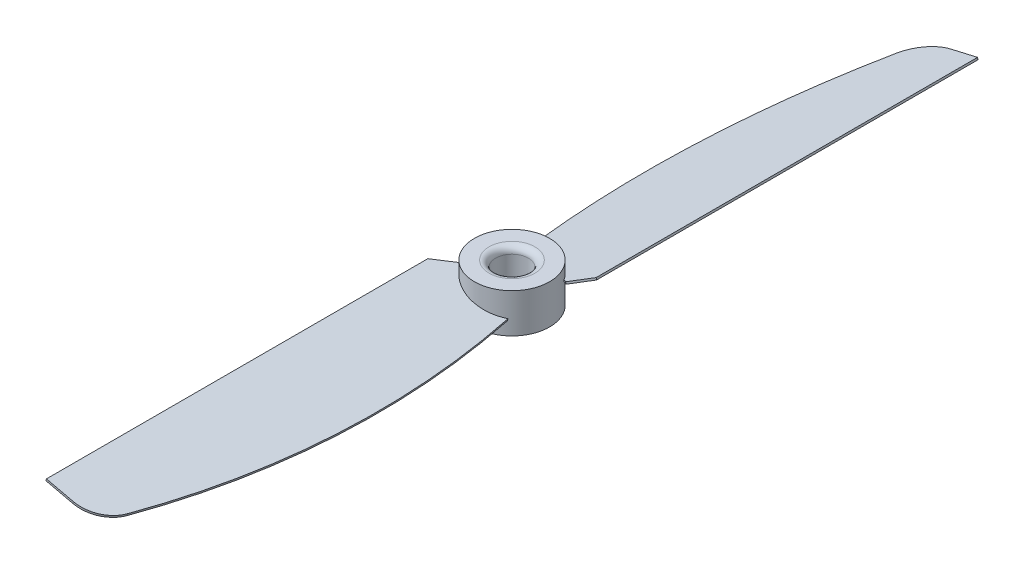
ISO-10303-21;
HEADER;
FILE_DESCRIPTION(('STEP AP214'),'2;1');
FILE_NAME('part.step','',(''),(''),'','','');
FILE_SCHEMA(('AUTOMOTIVE_DESIGN { 1 0 10303 214 1 1 1 1 }'));
ENDSEC;
DATA;
#1=APPLICATION_CONTEXT('core data for automotive mechanical design processes');
#2=APPLICATION_PROTOCOL_DEFINITION('international standard','automotive_design',2000,#1);
#3=PRODUCT_CONTEXT('',#1,'mechanical');
#4=PRODUCT('Part','Part','',(#3));
#5=PRODUCT_RELATED_PRODUCT_CATEGORY('part','',(#4));
#6=PRODUCT_DEFINITION_FORMATION('','',#4);
#7=PRODUCT_DEFINITION_CONTEXT('part definition',#1,'design');
#8=PRODUCT_DEFINITION('design','',#6,#7);
#9=PRODUCT_DEFINITION_SHAPE('','',#8);
#10=(LENGTH_UNIT() NAMED_UNIT(*) SI_UNIT(.MILLI.,.METRE.));
#11=(NAMED_UNIT(*) PLANE_ANGLE_UNIT() SI_UNIT($,.RADIAN.));
#12=(NAMED_UNIT(*) SI_UNIT($,.STERADIAN.) SOLID_ANGLE_UNIT());
#13=UNCERTAINTY_MEASURE_WITH_UNIT(LENGTH_MEASURE(1.E-05),#10,'distance_accuracy_value','');
#14=(GEOMETRIC_REPRESENTATION_CONTEXT(3) GLOBAL_UNCERTAINTY_ASSIGNED_CONTEXT((#13)) GLOBAL_UNIT_ASSIGNED_CONTEXT((#10,
#11,#12)) REPRESENTATION_CONTEXT('',''));
#15=CARTESIAN_POINT('',(0.,0.,0.));
#16=DIRECTION('',(0.,0.,1.));
#17=DIRECTION('',(1.,0.,0.));
#18=AXIS2_PLACEMENT_3D('',#15,#16,#17);
#19=CARTESIAN_POINT('',(0.,3.,0.));
#20=DIRECTION('',(0.,-1.,0.));
#21=DIRECTION('',(0.,0.,-1.));
#22=AXIS2_PLACEMENT_3D('',#19,#20,#21);
#23=CYLINDRICAL_SURFACE('',#22,5.75);
#24=CARTESIAN_POINT('',(0.,-0.153945616169009,0.));
#25=DIRECTION('',(0.224951054343865,0.974370064785235,0.));
#26=DIRECTION('',(0.974370064785235,-0.224951054343865,0.));
#27=AXIS2_PLACEMENT_3D('',#24,#25,#26);
#28=ELLIPSE('',#27,5.901248619812,5.75);
#29=CARTESIAN_POINT('',(-4.81679524919499,0.958099190034846,3.14022029917223));
#30=VERTEX_POINT('',#29);
#31=CARTESIAN_POINT('',(3.69343416007661,-1.00664207974727,4.40693137060024));
#32=VERTEX_POINT('',#31);
#33=EDGE_CURVE('E263',#30,#32,#28,.T.);
#34=ORIENTED_EDGE('',*,*,#33,.F.);
#35=CARTESIAN_POINT('',(-5.01099790460841,3.,2.82000000000181));
#36=CARTESIAN_POINT('',(-4.98435957875348,2.75333521853952,2.86729453573242));
#37=CARTESIAN_POINT('',(-4.95875906454369,2.50593733768936,2.9112585018136));
#38=CARTESIAN_POINT('',(-4.9097770267066,2.00995677254365,2.99314624383128));
#39=CARTESIAN_POINT('',(-4.88639520910258,1.76137424980963,3.03107082043824));
#40=CARTESIAN_POINT('',(-4.84202154089227,1.26363002897529,3.10145782518244));
#41=CARTESIAN_POINT('',(-4.82102600695424,1.01446984629513,3.13392870938984));
#42=CARTESIAN_POINT('',(-4.78141224905732,0.515376888592289,3.19403933249674));
#43=CARTESIAN_POINT('',(-4.76279410313816,0.265444088483488,3.22167891281569));
#44=CARTESIAN_POINT('',(-4.71049426952614,-0.485164034300471,3.29812336062005));
#45=CARTESIAN_POINT('',(-4.68035753807278,-0.986757471257977,3.34046877892435));
#46=CARTESIAN_POINT('',(-4.64177976149942,-1.74056558646675,3.39364554616675));
#47=CARTESIAN_POINT('',(-4.63001813796453,-1.99227826444247,3.40965644988569));
#48=CARTESIAN_POINT('',(-4.60860566926014,-2.49595987999339,3.43854259476011));
#49=CARTESIAN_POINT('',(-4.59895470600721,-2.74792880243989,3.45141801133877));
#50=CARTESIAN_POINT('',(-4.59030209218026,-3.00000000000025,3.46289282284704));
#51=B_SPLINE_CURVE_WITH_KNOTS('',3,(#35,#36,#37,#38,#39,#40,#41,#42,#43,#44,#45,#46,#47,#48,#49,
#50),.UNSPECIFIED.,.F.,.F.,(4,2,2,2,2,2,2,4),(0.,0.757649587981797,1.51519864699756,
2.27156204339986,3.02795026167649,4.54039745487371,5.29786427141661,6.05528869971719),.UNSPECIFIED.);
#52=CARTESIAN_POINT('',(-4.84315293595474,1.27207557383734,3.09941440258511));
#53=VERTEX_POINT('',#52);
#54=EDGE_CURVE('E255',#53,#30,#51,.T.);
#55=ORIENTED_EDGE('',*,*,#54,.F.);
#56=CARTESIAN_POINT('',(0.,0.153945616169009,0.));
#57=DIRECTION('',(0.224951054343865,0.974370064785235,0.));
#58=DIRECTION('',(0.974370064785235,-0.224951054343865,0.));
#59=AXIS2_PLACEMENT_3D('',#56,#57,#58);
#60=ELLIPSE('',#59,5.901248619812,5.75);
#61=CARTESIAN_POINT('',(3.75217962491468,-0.712313306613244,4.35702284391248));
#62=VERTEX_POINT('',#61);
#63=EDGE_CURVE('E334',#53,#62,#60,.T.);
#64=ORIENTED_EDGE('',*,*,#63,.T.);
#65=CARTESIAN_POINT('',(3.69343416007659,-1.00664207974726,4.40693137060013));
#66=CARTESIAN_POINT('',(3.70324697570012,-0.95757565117721,4.39870767048447));
#67=CARTESIAN_POINT('',(3.71304883891506,-0.908515039131019,4.390436776536));
#68=CARTESIAN_POINT('',(3.73263066052776,-0.810405448086349,4.37380060097345));
#69=CARTESIAN_POINT('',(3.74241061892552,-0.761356469087869,4.36543531935937));
#70=CARTESIAN_POINT('',(3.75217962491468,-0.712313306613245,4.35702284391248));
#71=B_SPLINE_CURVE_WITH_KNOTS('',3,(#65,#66,#67,#68,#69,#70),.UNSPECIFIED.,.F.,.F.,(4,2,4),(0.,
0.152127744911447,0.304255489822895),.UNSPECIFIED.);
#72=EDGE_CURVE('E247',#32,#62,#71,.T.);
#73=ORIENTED_EDGE('',*,*,#72,.F.);
#74=EDGE_LOOP('',(#34,#55,#64,#73));
#75=FACE_BOUND('',#74,.T.);
#76=CARTESIAN_POINT('',(0.,3.,0.));
#77=DIRECTION('',(0.,1.,0.));
#78=DIRECTION('',(0.,0.,1.));
#79=AXIS2_PLACEMENT_3D('',#76,#77,#78);
#80=CIRCLE('',#79,5.75);
#81=CARTESIAN_POINT('',(0.,3.,5.75));
#82=VERTEX_POINT('',#81);
#83=EDGE_CURVE('E332',#82,#82,#80,.T.);
#84=ORIENTED_EDGE('',*,*,#83,.F.);
#85=EDGE_LOOP('',(#84));
#86=FACE_BOUND('',#85,.T.);
#87=CARTESIAN_POINT('',(0.,-3.,0.));
#88=DIRECTION('',(0.,1.,0.));
#89=DIRECTION('',(0.,0.,1.));
#90=AXIS2_PLACEMENT_3D('',#87,#88,#89);
#91=CIRCLE('',#90,5.75);
#92=CARTESIAN_POINT('',(0.,-3.,5.75));
#93=VERTEX_POINT('',#92);
#94=EDGE_CURVE('E335',#93,#93,#91,.T.);
#95=ORIENTED_EDGE('',*,*,#94,.T.);
#96=EDGE_LOOP('',(#95));
#97=FACE_BOUND('',#96,.T.);
#98=CARTESIAN_POINT('',(0.,-0.153945616169009,0.));
#99=DIRECTION('',(-0.224951054343865,0.974370064785235,0.));
#100=DIRECTION('',(-0.974370064785235,-0.224951054343865,0.));
#101=AXIS2_PLACEMENT_3D('',#98,#99,#100);
#102=ELLIPSE('',#101,5.901248619812,5.75);
#103=CARTESIAN_POINT('',(4.81679524919499,0.958099190034846,-3.14022029917223));
#104=VERTEX_POINT('',#103);
#105=CARTESIAN_POINT('',(-3.69343416007661,-1.00664207974727,-4.40693137060024));
#106=VERTEX_POINT('',#105);
#107=EDGE_CURVE('E165',#104,#106,#102,.T.);
#108=ORIENTED_EDGE('',*,*,#107,.F.);
#109=CARTESIAN_POINT('',(5.01099790460841,3.,-2.82000000000181));
#110=CARTESIAN_POINT('',(4.98435957875348,2.75333521853952,-2.86729453573242));
#111=CARTESIAN_POINT('',(4.95875906454369,2.50593733768936,-2.9112585018136));
#112=CARTESIAN_POINT('',(4.9097770267066,2.00995677254365,-2.99314624383128));
#113=CARTESIAN_POINT('',(4.88639520910258,1.76137424980963,-3.03107082043824));
#114=CARTESIAN_POINT('',(4.84202154089227,1.26363002897529,-3.10145782518244));
#115=CARTESIAN_POINT('',(4.82102600695424,1.01446984629513,-3.13392870938984));
#116=CARTESIAN_POINT('',(4.78141224905732,0.515376888592289,-3.19403933249674));
#117=CARTESIAN_POINT('',(4.76279410313816,0.265444088483488,-3.22167891281569));
#118=CARTESIAN_POINT('',(4.71049426952614,-0.485164034300471,-3.29812336062005));
#119=CARTESIAN_POINT('',(4.68035753807278,-0.986757471257977,-3.34046877892435));
#120=CARTESIAN_POINT('',(4.64177976149942,-1.74056558646675,-3.39364554616675));
#121=CARTESIAN_POINT('',(4.63001813796453,-1.99227826444247,-3.40965644988569));
#122=CARTESIAN_POINT('',(4.60860566926014,-2.49595987999339,-3.43854259476011));
#123=CARTESIAN_POINT('',(4.59895470600721,-2.74792880243989,-3.45141801133877));
#124=CARTESIAN_POINT('',(4.59030209218026,-3.00000000000025,-3.46289282284704));
#125=B_SPLINE_CURVE_WITH_KNOTS('',3,(#109,#110,#111,#112,#113,#114,#115,#116,#117,#118,#119,
#120,#121,#122,#123,#124),.UNSPECIFIED.,.F.,.F.,(4,2,2,2,2,2,2,4),(0.,0.757649587981797,
1.51519864699756,2.27156204339986,3.02795026167649,4.54039745487371,5.29786427141661,
6.05528869971719),.UNSPECIFIED.);
#126=CARTESIAN_POINT('',(4.84315293595474,1.27207557383734,-3.09941440258511));
#127=VERTEX_POINT('',#126);
#128=EDGE_CURVE('E159',#127,#104,#125,.T.);
#129=ORIENTED_EDGE('',*,*,#128,.F.);
#130=CARTESIAN_POINT('',(0.,0.153945616169009,0.));
#131=DIRECTION('',(-0.224951054343865,0.974370064785235,0.));
#132=DIRECTION('',(-0.974370064785235,-0.224951054343865,0.));
#133=AXIS2_PLACEMENT_3D('',#130,#131,#132);
#134=ELLIPSE('',#133,5.901248619812,5.75);
#135=CARTESIAN_POINT('',(-3.75217962491468,-0.712313306613238,-4.35702284391248));
#136=VERTEX_POINT('',#135);
#137=EDGE_CURVE('E144',#127,#136,#134,.T.);
#138=ORIENTED_EDGE('',*,*,#137,.T.);
#139=CARTESIAN_POINT('',(-3.69343416007659,-1.00664207974726,-4.40693137060013));
#140=CARTESIAN_POINT('',(-3.70324697570012,-0.95757565117721,-4.39870767048447));
#141=CARTESIAN_POINT('',(-3.71304883891506,-0.908515039131019,-4.390436776536));
#142=CARTESIAN_POINT('',(-3.73263066052776,-0.810405448086349,-4.37380060097345));
#143=CARTESIAN_POINT('',(-3.74241061892552,-0.761356469087869,-4.36543531935937));
#144=CARTESIAN_POINT('',(-3.75217962491468,-0.712313306613245,-4.35702284391248));
#145=B_SPLINE_CURVE_WITH_KNOTS('',3,(#139,#140,#141,#142,#143,#144),.UNSPECIFIED.,.F.,.F.,(4,2,
4),(0.,0.152127744911447,0.304255489822895),.UNSPECIFIED.);
#146=EDGE_CURVE('E57',#106,#136,#145,.T.);
#147=ORIENTED_EDGE('',*,*,#146,.F.);
#148=EDGE_LOOP('',(#108,#129,#138,#147));
#149=FACE_BOUND('',#148,.T.);
#150=ADVANCED_FACE('F41',(#75,#86,#97,#149),#23,.T.);
#151=CARTESIAN_POINT('',(0.,3.,0.));
#152=DIRECTION('',(0.,1.,0.));
#153=DIRECTION('',(0.,0.,1.));
#154=AXIS2_PLACEMENT_3D('',#151,#152,#153);
#155=PLANE('',#154);
#156=CARTESIAN_POINT('',(0.,3.,0.));
#157=DIRECTION('',(0.,1.,0.));
#158=DIRECTION('',(0.,0.,1.));
#159=AXIS2_PLACEMENT_3D('',#156,#157,#158);
#160=CIRCLE('',#159,3.5);
#161=CARTESIAN_POINT('',(0.,3.,3.5));
#162=VERTEX_POINT('',#161);
#163=EDGE_CURVE('E11',#162,#162,#160,.F.);
#164=ORIENTED_EDGE('',*,*,#163,.T.);
#165=EDGE_LOOP('',(#164));
#166=FACE_BOUND('',#165,.T.);
#167=ORIENTED_EDGE('',*,*,#83,.T.);
#168=EDGE_LOOP('',(#167));
#169=FACE_BOUND('',#168,.T.);
#170=ADVANCED_FACE('F232',(#166,#169),#155,.T.);
#171=CARTESIAN_POINT('',(0.,-3.,0.));
#172=DIRECTION('',(0.,1.,0.));
#173=DIRECTION('',(0.,0.,1.));
#174=AXIS2_PLACEMENT_3D('',#171,#172,#173);
#175=PLANE('',#174);
#176=CARTESIAN_POINT('',(0.,-3.,0.));
#177=DIRECTION('',(0.,1.,0.));
#178=DIRECTION('',(0.,0.,1.));
#179=AXIS2_PLACEMENT_3D('',#176,#177,#178);
#180=CIRCLE('',#179,3.5);
#181=CARTESIAN_POINT('',(0.,-3.,3.5));
#182=VERTEX_POINT('',#181);
#183=EDGE_CURVE('E310',#182,#182,#180,.T.);
#184=ORIENTED_EDGE('',*,*,#183,.T.);
#185=EDGE_LOOP('',(#184));
#186=FACE_BOUND('',#185,.T.);
#187=ORIENTED_EDGE('',*,*,#94,.F.);
#188=EDGE_LOOP('',(#187));
#189=FACE_BOUND('',#188,.T.);
#190=ADVANCED_FACE('F238',(#186,#189),#175,.F.);
#191=CARTESIAN_POINT('',(-2.8301847440852,0.499454016249108,-1.80604327099362));
#192=DIRECTION('',(0.224951054343865,0.974370064785235,0.));
#193=DIRECTION('',(-0.974370064785235,0.224951054343865,0.));
#194=AXIS2_PLACEMENT_3D('',#191,#192,#193);
#195=CYLINDRICAL_SURFACE('',#194,5.35);
#196=CARTESIAN_POINT('',(-2.76269942778204,0.791765035684679,-1.80604327099362));
#197=DIRECTION('',(0.224951054343865,0.974370064785235,0.));
#198=DIRECTION('',(-0.974370064785235,0.224951054343865,0.));
#199=AXIS2_PLACEMENT_3D('',#196,#197,#198);
#200=CIRCLE('',#199,5.35);
#201=CARTESIAN_POINT('',(-5.38124055567702,1.39630288926968,2.82));
#202=VERTEX_POINT('',#201);
#203=EDGE_CURVE('E167',#202,#53,#200,.T.);
#204=ORIENTED_EDGE('',*,*,#203,.T.);
#205=ORIENTED_EDGE('',*,*,#54,.T.);
#206=CARTESIAN_POINT('',(-2.8301847440852,0.499454016249108,-1.80604327099362));
#207=DIRECTION('',(0.224951054343865,0.974370064785235,0.));
#208=DIRECTION('',(-0.974370064785235,0.224951054343865,0.));
#209=AXIS2_PLACEMENT_3D('',#206,#207,#208);
#210=CIRCLE('',#209,5.35);
#211=CARTESIAN_POINT('',(-5.44872587198018,1.10399186983411,2.82));
#212=VERTEX_POINT('',#211);
#213=EDGE_CURVE('E188',#212,#30,#210,.T.);
#214=ORIENTED_EDGE('',*,*,#213,.F.);
#215=DIRECTION('',(0.224951054343865,0.974370064785235,0.));
#216=VECTOR('',#215,1.);
#217=CARTESIAN_POINT('',(-5.44872587198018,1.10399186983411,2.82));
#218=LINE('',#217,#216);
#219=EDGE_CURVE('E358',#212,#202,#218,.T.);
#220=ORIENTED_EDGE('',*,*,#219,.T.);
#221=EDGE_LOOP('',(#204,#205,#214,#220));
#222=FACE_BOUND('',#221,.T.);
#223=ADVANCED_FACE('F265',(#222),#195,.F.);
#224=CARTESIAN_POINT('',(-114.748042352229,26.3377273568897,26.2278411063919));
#225=DIRECTION('',(0.224951054343865,0.974370064785235,0.));
#226=DIRECTION('',(-0.974370064785235,0.224951054343865,0.));
#227=AXIS2_PLACEMENT_3D('',#224,#225,#226);
#228=CYLINDRICAL_SURFACE('',#227,123.5);
#229=CARTESIAN_POINT('',(-114.748042352229,26.3377273568897,26.2278411063919));
#230=DIRECTION('',(-0.224951054343865,-0.974370064785235,0.));
#231=DIRECTION('',(-0.974370064785235,0.224951054343865,0.));
#232=AXIS2_PLACEMENT_3D('',#229,#230,#231);
#233=CIRCLE('',#232,123.5);
#234=CARTESIAN_POINT('',(1.03817689751966,-0.393627638567721,59.8616944680847));
#235=VERTEX_POINT('',#234);
#236=EDGE_CURVE('E304',#32,#235,#233,.T.);
#237=ORIENTED_EDGE('',*,*,#236,.F.);
#238=ORIENTED_EDGE('',*,*,#72,.T.);
#239=CARTESIAN_POINT('',(-114.680557035926,26.6300383763253,26.2278411063919));
#240=DIRECTION('',(-0.224951054343865,-0.974370064785235,0.));
#241=DIRECTION('',(-0.974370064785235,0.224951054343865,0.));
#242=AXIS2_PLACEMENT_3D('',#239,#240,#241);
#243=CIRCLE('',#242,123.5);
#244=CARTESIAN_POINT('',(1.10566221382282,-0.101316619132151,59.8616944680847));
#245=VERTEX_POINT('',#244);
#246=EDGE_CURVE('E65',#62,#245,#243,.T.);
#247=ORIENTED_EDGE('',*,*,#246,.T.);
#248=DIRECTION('',(0.224951054343865,0.974370064785235,0.));
#249=VECTOR('',#248,1.);
#250=CARTESIAN_POINT('',(1.03817689751966,-0.393627638567721,59.8616944680847));
#251=LINE('',#250,#249);
#252=EDGE_CURVE('E340',#235,#245,#251,.T.);
#253=ORIENTED_EDGE('',*,*,#252,.F.);
#254=EDGE_LOOP('',(#237,#238,#247,#253));
#255=FACE_BOUND('',#254,.T.);
#256=ADVANCED_FACE('F268',(#255),#228,.T.);
#257=CARTESIAN_POINT('',(-3.64952428668071,0.68861345436578,58.5));
#258=DIRECTION('',(0.224951054343865,0.974370064785235,0.));
#259=DIRECTION('',(-0.974370064785235,0.224951054343865,0.));
#260=AXIS2_PLACEMENT_3D('',#257,#258,#259);
#261=CYLINDRICAL_SURFACE('',#260,5.);
#262=CARTESIAN_POINT('',(-3.58203897037756,0.980924473801351,58.5));
#263=DIRECTION('',(-0.224951054343865,-0.974370064785235,0.));
#264=DIRECTION('',(-0.974370064785235,0.224951054343865,0.));
#265=AXIS2_PLACEMENT_3D('',#262,#263,#264);
#266=CIRCLE('',#265,5.);
#267=CARTESIAN_POINT('',(-3.58203897037756,0.980924473801351,63.5));
#268=VERTEX_POINT('',#267);
#269=EDGE_CURVE('E369',#245,#268,#266,.T.);
#270=ORIENTED_EDGE('',*,*,#269,.T.);
#271=DIRECTION('',(0.224951054343865,0.974370064785235,0.));
#272=VECTOR('',#271,1.);
#273=CARTESIAN_POINT('',(-3.64952428668071,0.68861345436578,63.5));
#274=LINE('',#273,#272);
#275=CARTESIAN_POINT('',(-3.64952428668071,0.68861345436578,63.5));
#276=VERTEX_POINT('',#275);
#277=EDGE_CURVE('E346',#276,#268,#274,.T.);
#278=ORIENTED_EDGE('',*,*,#277,.F.);
#279=CARTESIAN_POINT('',(-3.64952428668071,0.68861345436578,58.5));
#280=DIRECTION('',(-0.224951054343865,-0.974370064785235,0.));
#281=DIRECTION('',(-0.974370064785235,0.224951054343865,0.));
#282=AXIS2_PLACEMENT_3D('',#279,#280,#281);
#283=CIRCLE('',#282,5.);
#284=EDGE_CURVE('E382',#235,#276,#283,.T.);
#285=ORIENTED_EDGE('',*,*,#284,.F.);
#286=ORIENTED_EDGE('',*,*,#252,.T.);
#287=EDGE_LOOP('',(#270,#278,#285,#286));
#288=FACE_BOUND('',#287,.T.);
#289=ADVANCED_FACE('F273',(#288),#261,.T.);
#290=CARTESIAN_POINT('',(-7.75162225942656,1.63565739315345,63.5));
#291=DIRECTION('',(0.,0.,-1.));
#292=DIRECTION('',(-1.,0.,0.));
#293=AXIS2_PLACEMENT_3D('',#290,#291,#292);
#294=PLANE('',#293);
#295=DIRECTION('',(-0.974370064785235,0.224951054343865,0.));
#296=VECTOR('',#295,1.);
#297=CARTESIAN_POINT('',(-7.6841369431234,1.92796841258902,63.5));
#298=LINE('',#297,#296);
#299=CARTESIAN_POINT('',(-7.6841369431234,1.92796841258902,63.5));
#300=VERTEX_POINT('',#299);
#301=EDGE_CURVE('E366',#268,#300,#298,.T.);
#302=ORIENTED_EDGE('',*,*,#301,.T.);
#303=DIRECTION('',(0.224951054343865,0.974370064785235,0.));
#304=VECTOR('',#303,1.);
#305=CARTESIAN_POINT('',(-7.75162225942656,1.63565739315345,63.5));
#306=LINE('',#305,#304);
#307=CARTESIAN_POINT('',(-7.75162225942656,1.63565739315345,63.5));
#308=VERTEX_POINT('',#307);
#309=EDGE_CURVE('E350',#308,#300,#306,.T.);
#310=ORIENTED_EDGE('',*,*,#309,.F.);
#311=DIRECTION('',(-0.974370064785235,0.224951054343865,0.));
#312=VECTOR('',#311,1.);
#313=CARTESIAN_POINT('',(-7.75162225942656,1.63565739315345,63.5));
#314=LINE('',#313,#312);
#315=EDGE_CURVE('E379',#276,#308,#314,.T.);
#316=ORIENTED_EDGE('',*,*,#315,.F.);
#317=ORIENTED_EDGE('',*,*,#277,.T.);
#318=EDGE_LOOP('',(#302,#310,#316,#317));
#319=FACE_BOUND('',#318,.T.);
#320=ADVANCED_FACE('F277',(#319),#294,.F.);
#321=CARTESIAN_POINT('',(-7.75162225942656,1.63565739315345,5.18));
#322=DIRECTION('',(0.974370064785235,-0.224951054343865,0.));
#323=DIRECTION('',(0.224951054343865,0.974370064785235,0.));
#324=AXIS2_PLACEMENT_3D('',#321,#322,#323);
#325=PLANE('',#324);
#326=DIRECTION('',(0.,0.,-1.));
#327=VECTOR('',#326,1.);
#328=CARTESIAN_POINT('',(-7.6841369431234,1.92796841258902,5.18));
#329=LINE('',#328,#327);
#330=CARTESIAN_POINT('',(-7.6841369431234,1.92796841258902,5.18));
#331=VERTEX_POINT('',#330);
#332=EDGE_CURVE('E363',#300,#331,#329,.T.);
#333=ORIENTED_EDGE('',*,*,#332,.T.);
#334=DIRECTION('',(0.224951054343865,0.974370064785235,0.));
#335=VECTOR('',#334,1.);
#336=CARTESIAN_POINT('',(-7.75162225942656,1.63565739315345,5.18));
#337=LINE('',#336,#335);
#338=CARTESIAN_POINT('',(-7.75162225942656,1.63565739315345,5.18));
#339=VERTEX_POINT('',#338);
#340=EDGE_CURVE('E354',#339,#331,#337,.T.);
#341=ORIENTED_EDGE('',*,*,#340,.F.);
#342=DIRECTION('',(0.,0.,-1.));
#343=VECTOR('',#342,1.);
#344=CARTESIAN_POINT('',(-7.75162225942656,1.63565739315345,5.18));
#345=LINE('',#344,#343);
#346=EDGE_CURVE('E376',#308,#339,#345,.T.);
#347=ORIENTED_EDGE('',*,*,#346,.F.);
#348=ORIENTED_EDGE('',*,*,#309,.T.);
#349=EDGE_LOOP('',(#333,#341,#347,#348));
#350=FACE_BOUND('',#349,.T.);
#351=ADVANCED_FACE('F281',(#350),#325,.F.);
#352=CARTESIAN_POINT('',(-5.44872587198018,1.10399186983411,2.82));
#353=DIRECTION('',(0.688477051764418,-0.158947451572312,0.707626353969694));
#354=DIRECTION('',(0.716738215222348,0.,-0.697342334036794));
#355=AXIS2_PLACEMENT_3D('',#352,#353,#354);
#356=PLANE('',#355);
#357=DIRECTION('',(0.68948993636119,-0.159181294406988,-0.706586826347306));
#358=VECTOR('',#357,1.);
#359=CARTESIAN_POINT('',(-5.38124055567702,1.39630288926968,2.82));
#360=LINE('',#359,#358);
#361=EDGE_CURVE('E305',#331,#202,#360,.T.);
#362=ORIENTED_EDGE('',*,*,#361,.T.);
#363=ORIENTED_EDGE('',*,*,#219,.F.);
#364=DIRECTION('',(0.68948993636119,-0.159181294406988,-0.706586826347306));
#365=VECTOR('',#364,1.);
#366=CARTESIAN_POINT('',(-5.44872587198018,1.10399186983411,2.82));
#367=LINE('',#366,#365);
#368=EDGE_CURVE('E300',#339,#212,#367,.T.);
#369=ORIENTED_EDGE('',*,*,#368,.F.);
#370=ORIENTED_EDGE('',*,*,#340,.T.);
#371=EDGE_LOOP('',(#362,#363,#369,#370));
#372=FACE_BOUND('',#371,.T.);
#373=ADVANCED_FACE('F285',(#372),#356,.F.);
#374=CARTESIAN_POINT('',(-2.8301847440852,0.499454016249108,-1.80604327099362));
#375=DIRECTION('',(0.224951054343865,0.974370064785235,0.));
#376=DIRECTION('',(-0.974370064785235,0.224951054343865,0.));
#377=AXIS2_PLACEMENT_3D('',#374,#375,#376);
#378=PLANE('',#377);
#379=ORIENTED_EDGE('',*,*,#213,.T.);
#380=ORIENTED_EDGE('',*,*,#33,.T.);
#381=ORIENTED_EDGE('',*,*,#236,.T.);
#382=ORIENTED_EDGE('',*,*,#284,.T.);
#383=ORIENTED_EDGE('',*,*,#315,.T.);
#384=ORIENTED_EDGE('',*,*,#346,.T.);
#385=ORIENTED_EDGE('',*,*,#368,.T.);
#386=EDGE_LOOP('',(#379,#380,#381,#382,#383,#384,#385));
#387=FACE_BOUND('',#386,.T.);
#388=ADVANCED_FACE('F289',(#387),#378,.F.);
#389=CARTESIAN_POINT('',(-2.76269942778204,0.791765035684679,-1.80604327099362));
#390=DIRECTION('',(0.224951054343865,0.974370064785235,0.));
#391=DIRECTION('',(-0.974370064785235,0.224951054343865,0.));
#392=AXIS2_PLACEMENT_3D('',#389,#390,#391);
#393=PLANE('',#392);
#394=ORIENTED_EDGE('',*,*,#63,.F.);
#395=ORIENTED_EDGE('',*,*,#203,.F.);
#396=ORIENTED_EDGE('',*,*,#361,.F.);
#397=ORIENTED_EDGE('',*,*,#332,.F.);
#398=ORIENTED_EDGE('',*,*,#301,.F.);
#399=ORIENTED_EDGE('',*,*,#269,.F.);
#400=ORIENTED_EDGE('',*,*,#246,.F.);
#401=EDGE_LOOP('',(#394,#395,#396,#397,#398,#399,#400));
#402=FACE_BOUND('',#401,.T.);
#403=ADVANCED_FACE('F195',(#402),#393,.T.);
#404=CARTESIAN_POINT('',(2.8301847440852,0.499454016249108,1.80604327099362));
#405=DIRECTION('',(-0.224951054343865,0.974370064785235,0.));
#406=DIRECTION('',(0.974370064785235,0.224951054343865,0.));
#407=AXIS2_PLACEMENT_3D('',#404,#405,#406);
#408=CYLINDRICAL_SURFACE('',#407,5.35);
#409=CARTESIAN_POINT('',(2.76269942778204,0.791765035684679,1.80604327099362));
#410=DIRECTION('',(-0.224951054343865,0.974370064785235,0.));
#411=DIRECTION('',(0.974370064785235,0.224951054343865,0.));
#412=AXIS2_PLACEMENT_3D('',#409,#410,#411);
#413=CIRCLE('',#412,5.35);
#414=CARTESIAN_POINT('',(5.38124055567702,1.39630288926968,-2.82));
#415=VERTEX_POINT('',#414);
#416=EDGE_CURVE('E147',#415,#127,#413,.T.);
#417=ORIENTED_EDGE('',*,*,#416,.T.);
#418=ORIENTED_EDGE('',*,*,#128,.T.);
#419=CARTESIAN_POINT('',(2.8301847440852,0.499454016249108,1.80604327099362));
#420=DIRECTION('',(-0.224951054343865,0.974370064785235,0.));
#421=DIRECTION('',(0.974370064785235,0.224951054343865,0.));
#422=AXIS2_PLACEMENT_3D('',#419,#420,#421);
#423=CIRCLE('',#422,5.35);
#424=CARTESIAN_POINT('',(5.44872587198018,1.10399186983411,-2.82));
#425=VERTEX_POINT('',#424);
#426=EDGE_CURVE('E553',#425,#104,#423,.T.);
#427=ORIENTED_EDGE('',*,*,#426,.F.);
#428=DIRECTION('',(-0.224951054343865,0.974370064785235,0.));
#429=VECTOR('',#428,1.);
#430=CARTESIAN_POINT('',(5.44872587198018,1.10399186983411,-2.82));
#431=LINE('',#430,#429);
#432=EDGE_CURVE('E161',#425,#415,#431,.T.);
#433=ORIENTED_EDGE('',*,*,#432,.T.);
#434=EDGE_LOOP('',(#417,#418,#427,#433));
#435=FACE_BOUND('',#434,.T.);
#436=ADVANCED_FACE('F157',(#435),#408,.F.);
#437=CARTESIAN_POINT('',(114.748042352229,26.3377273568897,-26.2278411063919));
#438=DIRECTION('',(-0.224951054343865,0.974370064785235,0.));
#439=DIRECTION('',(0.974370064785235,0.224951054343865,0.));
#440=AXIS2_PLACEMENT_3D('',#437,#438,#439);
#441=CYLINDRICAL_SURFACE('',#440,123.5);
#442=CARTESIAN_POINT('',(114.748042352229,26.3377273568897,-26.2278411063919));
#443=DIRECTION('',(0.224951054343865,-0.974370064785235,0.));
#444=DIRECTION('',(0.974370064785235,0.224951054343865,0.));
#445=AXIS2_PLACEMENT_3D('',#442,#443,#444);
#446=CIRCLE('',#445,123.5);
#447=CARTESIAN_POINT('',(-1.03817689751966,-0.393627638567721,-59.8616944680847));
#448=VERTEX_POINT('',#447);
#449=EDGE_CURVE('E558',#106,#448,#446,.T.);
#450=ORIENTED_EDGE('',*,*,#449,.F.);
#451=ORIENTED_EDGE('',*,*,#146,.T.);
#452=CARTESIAN_POINT('',(114.680557035926,26.6300383763253,-26.2278411063919));
#453=DIRECTION('',(0.224951054343865,-0.974370064785235,0.));
#454=DIRECTION('',(0.974370064785235,0.224951054343865,0.));
#455=AXIS2_PLACEMENT_3D('',#452,#453,#454);
#456=CIRCLE('',#455,123.5);
#457=CARTESIAN_POINT('',(-1.10566221382282,-0.101316619132151,-59.8616944680847));
#458=VERTEX_POINT('',#457);
#459=EDGE_CURVE('E149',#136,#458,#456,.T.);
#460=ORIENTED_EDGE('',*,*,#459,.T.);
#461=DIRECTION('',(-0.224951054343865,0.974370064785235,0.));
#462=VECTOR('',#461,1.);
#463=CARTESIAN_POINT('',(-1.03817689751966,-0.393627638567721,-59.8616944680847));
#464=LINE('',#463,#462);
#465=EDGE_CURVE('E173',#448,#458,#464,.T.);
#466=ORIENTED_EDGE('',*,*,#465,.F.);
#467=EDGE_LOOP('',(#450,#451,#460,#466));
#468=FACE_BOUND('',#467,.T.);
#469=ADVANCED_FACE('F194',(#468),#441,.T.);
#470=CARTESIAN_POINT('',(3.64952428668071,0.68861345436578,-58.5));
#471=DIRECTION('',(-0.224951054343865,0.974370064785235,0.));
#472=DIRECTION('',(0.974370064785235,0.224951054343865,0.));
#473=AXIS2_PLACEMENT_3D('',#470,#471,#472);
#474=CYLINDRICAL_SURFACE('',#473,5.);
#475=CARTESIAN_POINT('',(3.58203897037756,0.980924473801351,-58.5));
#476=DIRECTION('',(0.224951054343865,-0.974370064785235,0.));
#477=DIRECTION('',(0.974370064785235,0.224951054343865,0.));
#478=AXIS2_PLACEMENT_3D('',#475,#476,#477);
#479=CIRCLE('',#478,5.);
#480=CARTESIAN_POINT('',(3.58203897037756,0.980924473801351,-63.5));
#481=VERTEX_POINT('',#480);
#482=EDGE_CURVE('E540',#458,#481,#479,.T.);
#483=ORIENTED_EDGE('',*,*,#482,.T.);
#484=DIRECTION('',(-0.224951054343865,0.974370064785235,0.));
#485=VECTOR('',#484,1.);
#486=CARTESIAN_POINT('',(3.64952428668071,0.68861345436578,-63.5));
#487=LINE('',#486,#485);
#488=CARTESIAN_POINT('',(3.64952428668071,0.68861345436578,-63.5));
#489=VERTEX_POINT('',#488);
#490=EDGE_CURVE('E575',#489,#481,#487,.T.);
#491=ORIENTED_EDGE('',*,*,#490,.F.);
#492=CARTESIAN_POINT('',(3.64952428668071,0.68861345436578,-58.5));
#493=DIRECTION('',(0.224951054343865,-0.974370064785235,0.));
#494=DIRECTION('',(0.974370064785235,0.224951054343865,0.));
#495=AXIS2_PLACEMENT_3D('',#492,#493,#494);
#496=CIRCLE('',#495,5.);
#497=EDGE_CURVE('E561',#448,#489,#496,.T.);
#498=ORIENTED_EDGE('',*,*,#497,.F.);
#499=ORIENTED_EDGE('',*,*,#465,.T.);
#500=EDGE_LOOP('',(#483,#491,#498,#499));
#501=FACE_BOUND('',#500,.T.);
#502=ADVANCED_FACE('F199',(#501),#474,.T.);
#503=CARTESIAN_POINT('',(7.75162225942656,1.63565739315345,-63.5));
#504=DIRECTION('',(0.,0.,1.));
#505=DIRECTION('',(1.,0.,0.));
#506=AXIS2_PLACEMENT_3D('',#503,#504,#505);
#507=PLANE('',#506);
#508=DIRECTION('',(0.974370064785235,0.224951054343865,0.));
#509=VECTOR('',#508,1.);
#510=CARTESIAN_POINT('',(7.6841369431234,1.92796841258902,-63.5));
#511=LINE('',#510,#509);
#512=CARTESIAN_POINT('',(7.6841369431234,1.92796841258902,-63.5));
#513=VERTEX_POINT('',#512);
#514=EDGE_CURVE('E534',#481,#513,#511,.T.);
#515=ORIENTED_EDGE('',*,*,#514,.T.);
#516=DIRECTION('',(-0.224951054343865,0.974370064785235,0.));
#517=VECTOR('',#516,1.);
#518=CARTESIAN_POINT('',(7.75162225942656,1.63565739315345,-63.5));
#519=LINE('',#518,#517);
#520=CARTESIAN_POINT('',(7.75162225942656,1.63565739315345,-63.5));
#521=VERTEX_POINT('',#520);
#522=EDGE_CURVE('E571',#521,#513,#519,.T.);
#523=ORIENTED_EDGE('',*,*,#522,.F.);
#524=DIRECTION('',(0.974370064785235,0.224951054343865,0.));
#525=VECTOR('',#524,1.);
#526=CARTESIAN_POINT('',(7.75162225942656,1.63565739315345,-63.5));
#527=LINE('',#526,#525);
#528=EDGE_CURVE('E564',#489,#521,#527,.T.);
#529=ORIENTED_EDGE('',*,*,#528,.F.);
#530=ORIENTED_EDGE('',*,*,#490,.T.);
#531=EDGE_LOOP('',(#515,#523,#529,#530));
#532=FACE_BOUND('',#531,.T.);
#533=ADVANCED_FACE('F202',(#532),#507,.F.);
#534=CARTESIAN_POINT('',(7.75162225942656,1.63565739315345,-5.18));
#535=DIRECTION('',(-0.974370064785235,-0.224951054343865,0.));
#536=DIRECTION('',(-0.224951054343865,0.974370064785235,0.));
#537=AXIS2_PLACEMENT_3D('',#534,#535,#536);
#538=PLANE('',#537);
#539=DIRECTION('',(0.,0.,1.));
#540=VECTOR('',#539,1.);
#541=CARTESIAN_POINT('',(7.6841369431234,1.92796841258902,-5.18));
#542=LINE('',#541,#540);
#543=CARTESIAN_POINT('',(7.6841369431234,1.92796841258902,-5.18));
#544=VERTEX_POINT('',#543);
#545=EDGE_CURVE('E531',#513,#544,#542,.T.);
#546=ORIENTED_EDGE('',*,*,#545,.T.);
#547=DIRECTION('',(-0.224951054343865,0.974370064785235,0.));
#548=VECTOR('',#547,1.);
#549=CARTESIAN_POINT('',(7.75162225942656,1.63565739315345,-5.18));
#550=LINE('',#549,#548);
#551=CARTESIAN_POINT('',(7.75162225942656,1.63565739315345,-5.18));
#552=VERTEX_POINT('',#551);
#553=EDGE_CURVE('E528',#552,#544,#550,.T.);
#554=ORIENTED_EDGE('',*,*,#553,.F.);
#555=DIRECTION('',(0.,0.,1.));
#556=VECTOR('',#555,1.);
#557=CARTESIAN_POINT('',(7.75162225942656,1.63565739315345,-5.18));
#558=LINE('',#557,#556);
#559=EDGE_CURVE('E567',#521,#552,#558,.T.);
#560=ORIENTED_EDGE('',*,*,#559,.F.);
#561=ORIENTED_EDGE('',*,*,#522,.T.);
#562=EDGE_LOOP('',(#546,#554,#560,#561));
#563=FACE_BOUND('',#562,.T.);
#564=ADVANCED_FACE('F206',(#563),#538,.F.);
#565=CARTESIAN_POINT('',(2.8301847440852,0.499454016249108,1.80604327099362));
#566=DIRECTION('',(-0.224951054343865,0.974370064785235,0.));
#567=DIRECTION('',(0.974370064785235,0.224951054343865,0.));
#568=AXIS2_PLACEMENT_3D('',#565,#566,#567);
#569=PLANE('',#568);
#570=ORIENTED_EDGE('',*,*,#426,.T.);
#571=ORIENTED_EDGE('',*,*,#107,.T.);
#572=ORIENTED_EDGE('',*,*,#449,.T.);
#573=ORIENTED_EDGE('',*,*,#497,.T.);
#574=ORIENTED_EDGE('',*,*,#528,.T.);
#575=ORIENTED_EDGE('',*,*,#559,.T.);
#576=DIRECTION('',(-0.68948993636119,-0.159181294406988,0.706586826347306));
#577=VECTOR('',#576,1.);
#578=CARTESIAN_POINT('',(5.44872587198018,1.10399186983411,-2.82));
#579=LINE('',#578,#577);
#580=EDGE_CURVE('E548',#552,#425,#579,.T.);
#581=ORIENTED_EDGE('',*,*,#580,.T.);
#582=EDGE_LOOP('',(#570,#571,#572,#573,#574,#575,#581));
#583=FACE_BOUND('',#582,.T.);
#584=ADVANCED_FACE('F210',(#583),#569,.F.);
#585=CARTESIAN_POINT('',(5.44872587198018,1.10399186983411,-2.82));
#586=DIRECTION('',(-0.688477051764418,-0.158947451572312,-0.707626353969694));
#587=DIRECTION('',(-0.716738215222348,0.,0.697342334036794));
#588=AXIS2_PLACEMENT_3D('',#585,#586,#587);
#589=PLANE('',#588);
#590=DIRECTION('',(-0.68948993636119,-0.159181294406988,0.706586826347306));
#591=VECTOR('',#590,1.);
#592=CARTESIAN_POINT('',(5.38124055567702,1.39630288926968,-2.82));
#593=LINE('',#592,#591);
#594=EDGE_CURVE('E163',#544,#415,#593,.T.);
#595=ORIENTED_EDGE('',*,*,#594,.T.);
#596=ORIENTED_EDGE('',*,*,#432,.F.);
#597=ORIENTED_EDGE('',*,*,#580,.F.);
#598=ORIENTED_EDGE('',*,*,#553,.T.);
#599=EDGE_LOOP('',(#595,#596,#597,#598));
#600=FACE_BOUND('',#599,.T.);
#601=ADVANCED_FACE('F214',(#600),#589,.F.);
#602=CARTESIAN_POINT('',(2.76269942778204,0.791765035684679,1.80604327099362));
#603=DIRECTION('',(-0.224951054343865,0.974370064785235,0.));
#604=DIRECTION('',(0.974370064785235,0.224951054343865,0.));
#605=AXIS2_PLACEMENT_3D('',#602,#603,#604);
#606=PLANE('',#605);
#607=ORIENTED_EDGE('',*,*,#137,.F.);
#608=ORIENTED_EDGE('',*,*,#416,.F.);
#609=ORIENTED_EDGE('',*,*,#594,.F.);
#610=ORIENTED_EDGE('',*,*,#545,.F.);
#611=ORIENTED_EDGE('',*,*,#514,.F.);
#612=ORIENTED_EDGE('',*,*,#482,.F.);
#613=ORIENTED_EDGE('',*,*,#459,.F.);
#614=EDGE_LOOP('',(#607,#608,#609,#610,#611,#612,#613));
#615=FACE_BOUND('',#614,.T.);
#616=ADVANCED_FACE('F146',(#615),#606,.T.);
#617=CARTESIAN_POINT('',(0.,-3.,0.));
#618=DIRECTION('',(0.,1.,0.));
#619=DIRECTION('',(0.,0.,1.));
#620=AXIS2_PLACEMENT_3D('',#617,#618,#619);
#621=CYLINDRICAL_SURFACE('',#620,2.5);
#622=CARTESIAN_POINT('',(0.,-2.,0.));
#623=DIRECTION('',(0.,1.,0.));
#624=DIRECTION('',(0.,0.,1.));
#625=AXIS2_PLACEMENT_3D('',#622,#623,#624);
#626=CIRCLE('',#625,2.5);
#627=CARTESIAN_POINT('',(0.,-2.,2.5));
#628=VERTEX_POINT('',#627);
#629=EDGE_CURVE('E50',#628,#628,#626,.F.);
#630=ORIENTED_EDGE('',*,*,#629,.T.);
#631=EDGE_LOOP('',(#630));
#632=FACE_BOUND('',#631,.T.);
#633=CARTESIAN_POINT('',(0.,2.,0.));
#634=DIRECTION('',(0.,1.,0.));
#635=DIRECTION('',(0.,0.,1.));
#636=AXIS2_PLACEMENT_3D('',#633,#634,#635);
#637=CIRCLE('',#636,2.5);
#638=CARTESIAN_POINT('',(0.,2.,2.5));
#639=VERTEX_POINT('',#638);
#640=EDGE_CURVE('E313',#639,#639,#637,.T.);
#641=ORIENTED_EDGE('',*,*,#640,.T.);
#642=EDGE_LOOP('',(#641));
#643=FACE_BOUND('',#642,.T.);
#644=ADVANCED_FACE('F221',(#632,#643),#621,.F.);
#645=CARTESIAN_POINT('',(0.,-2.,0.));
#646=DIRECTION('',(0.,1.,0.));
#647=DIRECTION('',(0.,0.,1.));
#648=AXIS2_PLACEMENT_3D('',#645,#646,#647);
#649=TOROIDAL_SURFACE('',#648,3.5,1.);
#650=ORIENTED_EDGE('',*,*,#629,.F.);
#651=EDGE_LOOP('',(#650));
#652=FACE_BOUND('',#651,.T.);
#653=ORIENTED_EDGE('',*,*,#183,.F.);
#654=EDGE_LOOP('',(#653));
#655=FACE_BOUND('',#654,.T.);
#656=ADVANCED_FACE('F223',(#652,#655),#649,.T.);
#657=CARTESIAN_POINT('',(0.,2.,0.));
#658=DIRECTION('',(0.,1.,0.));
#659=DIRECTION('',(0.,0.,1.));
#660=AXIS2_PLACEMENT_3D('',#657,#658,#659);
#661=TOROIDAL_SURFACE('',#660,3.5,1.);
#662=ORIENTED_EDGE('',*,*,#163,.F.);
#663=EDGE_LOOP('',(#662));
#664=FACE_BOUND('',#663,.T.);
#665=ORIENTED_EDGE('',*,*,#640,.F.);
#666=EDGE_LOOP('',(#665));
#667=FACE_BOUND('',#666,.T.);
#668=ADVANCED_FACE('F43',(#664,#667),#661,.T.);
#669=CLOSED_SHELL('',(#150,#170,#190,#223,#256,#289,#320,#351,#373,#388,#403,#436,#469,#502,
#533,#564,#584,#601,#616,#644,#656,#668));
#670=MANIFOLD_SOLID_BREP('B2',#669);
#671=ADVANCED_BREP_SHAPE_REPRESENTATION('',(#18,#670),#14);
#672=SHAPE_DEFINITION_REPRESENTATION(#9,#671);
ENDSEC;
END-ISO-10303-21;
